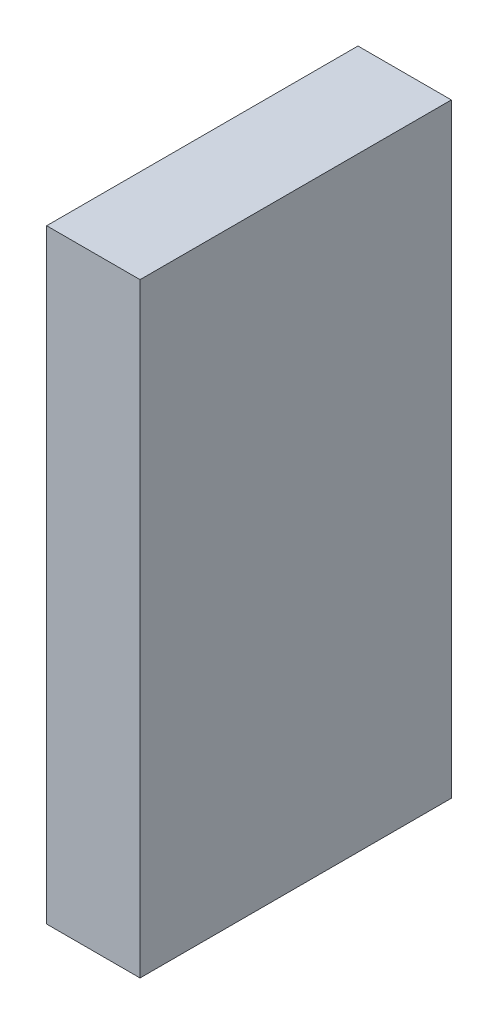
ISO-10303-21;
HEADER;
FILE_DESCRIPTION(('STEP AP214'),'2;1');
FILE_NAME('part.step','',(''),(''),'','','');
FILE_SCHEMA(('AUTOMOTIVE_DESIGN { 1 0 10303 214 1 1 1 1 }'));
ENDSEC;
DATA;
#1=APPLICATION_CONTEXT('core data for automotive mechanical design processes');
#2=APPLICATION_PROTOCOL_DEFINITION('international standard','automotive_design',2000,#1);
#3=PRODUCT_CONTEXT('',#1,'mechanical');
#4=PRODUCT('Part','Part','',(#3));
#5=PRODUCT_RELATED_PRODUCT_CATEGORY('part','',(#4));
#6=PRODUCT_DEFINITION_FORMATION('','',#4);
#7=PRODUCT_DEFINITION_CONTEXT('part definition',#1,'design');
#8=PRODUCT_DEFINITION('design','',#6,#7);
#9=PRODUCT_DEFINITION_SHAPE('','',#8);
#10=(LENGTH_UNIT() NAMED_UNIT(*) SI_UNIT(.MILLI.,.METRE.));
#11=(NAMED_UNIT(*) PLANE_ANGLE_UNIT() SI_UNIT($,.RADIAN.));
#12=(NAMED_UNIT(*) SI_UNIT($,.STERADIAN.) SOLID_ANGLE_UNIT());
#13=UNCERTAINTY_MEASURE_WITH_UNIT(LENGTH_MEASURE(1.E-05),#10,'distance_accuracy_value','');
#14=(GEOMETRIC_REPRESENTATION_CONTEXT(3) GLOBAL_UNCERTAINTY_ASSIGNED_CONTEXT((#13)) GLOBAL_UNIT_ASSIGNED_CONTEXT((#10,
#11,#12)) REPRESENTATION_CONTEXT('',''));
#15=CARTESIAN_POINT('',(0.,0.,0.));
#16=DIRECTION('',(0.,0.,1.));
#17=DIRECTION('',(1.,0.,0.));
#18=AXIS2_PLACEMENT_3D('',#15,#16,#17);
#19=CARTESIAN_POINT('',(4.1435,1.7,0.));
#20=DIRECTION('',(1.,0.,0.));
#21=DIRECTION('',(0.,0.,-1.));
#22=AXIS2_PLACEMENT_3D('',#19,#20,#21);
#23=PLANE('',#22);
#24=DIRECTION('',(0.,0.,-1.));
#25=VECTOR('',#24,1.);
#26=CARTESIAN_POINT('',(4.1435,-1.7,0.));
#27=LINE('',#26,#25);
#28=CARTESIAN_POINT('',(4.1435,-1.7,0.));
#29=VERTEX_POINT('',#28);
#30=CARTESIAN_POINT('',(4.1435,-1.7,1.75));
#31=VERTEX_POINT('',#30);
#32=EDGE_CURVE('E20',#29,#31,#27,.F.);
#33=ORIENTED_EDGE('',*,*,#32,.F.);
#34=DIRECTION('',(0.,1.,0.));
#35=VECTOR('',#34,1.);
#36=CARTESIAN_POINT('',(4.1435,-1.7,0.));
#37=LINE('',#36,#35);
#38=CARTESIAN_POINT('',(4.1435,1.7,0.));
#39=VERTEX_POINT('',#38);
#40=EDGE_CURVE('E80',#29,#39,#37,.T.);
#41=ORIENTED_EDGE('',*,*,#40,.T.);
#42=DIRECTION('',(0.,0.,1.));
#43=VECTOR('',#42,1.);
#44=CARTESIAN_POINT('',(4.1435,1.7,0.));
#45=LINE('',#44,#43);
#46=CARTESIAN_POINT('',(4.1435,1.7,1.75));
#47=VERTEX_POINT('',#46);
#48=EDGE_CURVE('E68',#47,#39,#45,.F.);
#49=ORIENTED_EDGE('',*,*,#48,.F.);
#50=DIRECTION('',(0.,1.,0.));
#51=VECTOR('',#50,1.);
#52=CARTESIAN_POINT('',(4.1435,-1.7,1.75));
#53=LINE('',#52,#51);
#54=EDGE_CURVE('E56',#31,#47,#53,.T.);
#55=ORIENTED_EDGE('',*,*,#54,.F.);
#56=EDGE_LOOP('',(#33,#41,#49,#55));
#57=FACE_BOUND('',#56,.T.);
#58=ADVANCED_FACE('F17',(#57),#23,.T.);
#59=CARTESIAN_POINT('',(4.1435,-1.7,0.));
#60=DIRECTION('',(0.,-1.,0.));
#61=DIRECTION('',(0.,0.,-1.));
#62=AXIS2_PLACEMENT_3D('',#59,#60,#61);
#63=PLANE('',#62);
#64=DIRECTION('',(0.,0.,1.));
#65=VECTOR('',#64,1.);
#66=CARTESIAN_POINT('',(3.6185,-1.7,0.));
#67=LINE('',#66,#65);
#68=CARTESIAN_POINT('',(3.6185,-1.7,0.));
#69=VERTEX_POINT('',#68);
#70=CARTESIAN_POINT('',(3.6185,-1.7,1.75));
#71=VERTEX_POINT('',#70);
#72=EDGE_CURVE('E83',#69,#71,#67,.T.);
#73=ORIENTED_EDGE('',*,*,#72,.F.);
#74=DIRECTION('',(1.,0.,0.));
#75=VECTOR('',#74,1.);
#76=CARTESIAN_POINT('',(3.6185,-1.7,0.));
#77=LINE('',#76,#75);
#78=EDGE_CURVE('E65',#69,#29,#77,.T.);
#79=ORIENTED_EDGE('',*,*,#78,.T.);
#80=ORIENTED_EDGE('',*,*,#32,.T.);
#81=DIRECTION('',(1.,0.,0.));
#82=VECTOR('',#81,1.);
#83=CARTESIAN_POINT('',(3.6185,-1.7,1.75));
#84=LINE('',#83,#82);
#85=EDGE_CURVE('E62',#71,#31,#84,.T.);
#86=ORIENTED_EDGE('',*,*,#85,.F.);
#87=EDGE_LOOP('',(#73,#79,#80,#86));
#88=FACE_BOUND('',#87,.T.);
#89=ADVANCED_FACE('F61',(#88),#63,.T.);
#90=CARTESIAN_POINT('',(3.6185,-1.7,1.75));
#91=DIRECTION('',(0.,0.,1.));
#92=DIRECTION('',(1.,0.,0.));
#93=AXIS2_PLACEMENT_3D('',#90,#91,#92);
#94=PLANE('',#93);
#95=DIRECTION('',(1.,0.,0.));
#96=VECTOR('',#95,1.);
#97=CARTESIAN_POINT('',(3.6185,1.7,1.75));
#98=LINE('',#97,#96);
#99=CARTESIAN_POINT('',(3.6185,1.7,1.75));
#100=VERTEX_POINT('',#99);
#101=EDGE_CURVE('E70',#100,#47,#98,.T.);
#102=ORIENTED_EDGE('',*,*,#101,.F.);
#103=DIRECTION('',(0.,1.,0.));
#104=VECTOR('',#103,1.);
#105=CARTESIAN_POINT('',(3.6185,-1.7,1.75));
#106=LINE('',#105,#104);
#107=EDGE_CURVE('E74',#71,#100,#106,.T.);
#108=ORIENTED_EDGE('',*,*,#107,.F.);
#109=ORIENTED_EDGE('',*,*,#85,.T.);
#110=ORIENTED_EDGE('',*,*,#54,.T.);
#111=EDGE_LOOP('',(#102,#108,#109,#110));
#112=FACE_BOUND('',#111,.T.);
#113=ADVANCED_FACE('F72',(#112),#94,.T.);
#114=CARTESIAN_POINT('',(3.6185,1.7,0.));
#115=DIRECTION('',(0.,1.,0.));
#116=DIRECTION('',(0.,0.,1.));
#117=AXIS2_PLACEMENT_3D('',#114,#115,#116);
#118=PLANE('',#117);
#119=ORIENTED_EDGE('',*,*,#48,.T.);
#120=DIRECTION('',(1.,0.,0.));
#121=VECTOR('',#120,1.);
#122=CARTESIAN_POINT('',(3.6185,1.7,0.));
#123=LINE('',#122,#121);
#124=CARTESIAN_POINT('',(3.6185,1.7,0.));
#125=VERTEX_POINT('',#124);
#126=EDGE_CURVE('E35',#39,#125,#123,.F.);
#127=ORIENTED_EDGE('',*,*,#126,.T.);
#128=DIRECTION('',(0.,0.,1.));
#129=VECTOR('',#128,1.);
#130=CARTESIAN_POINT('',(3.6185,1.7,0.));
#131=LINE('',#130,#129);
#132=EDGE_CURVE('E26',#100,#125,#131,.F.);
#133=ORIENTED_EDGE('',*,*,#132,.F.);
#134=ORIENTED_EDGE('',*,*,#101,.T.);
#135=EDGE_LOOP('',(#119,#127,#133,#134));
#136=FACE_BOUND('',#135,.T.);
#137=ADVANCED_FACE('F89',(#136),#118,.T.);
#138=CARTESIAN_POINT('',(3.6185,-1.7,0.));
#139=DIRECTION('',(0.,0.,1.));
#140=DIRECTION('',(1.,0.,0.));
#141=AXIS2_PLACEMENT_3D('',#138,#139,#140);
#142=PLANE('',#141);
#143=ORIENTED_EDGE('',*,*,#126,.F.);
#144=ORIENTED_EDGE('',*,*,#40,.F.);
#145=ORIENTED_EDGE('',*,*,#78,.F.);
#146=DIRECTION('',(0.,1.,0.));
#147=VECTOR('',#146,1.);
#148=CARTESIAN_POINT('',(3.6185,-1.7,0.));
#149=LINE('',#148,#147);
#150=EDGE_CURVE('E11',#125,#69,#149,.F.);
#151=ORIENTED_EDGE('',*,*,#150,.F.);
#152=EDGE_LOOP('',(#143,#144,#145,#151));
#153=FACE_BOUND('',#152,.T.);
#154=ADVANCED_FACE('F91',(#153),#142,.F.);
#155=CARTESIAN_POINT('',(3.6185,-1.7,0.));
#156=DIRECTION('',(-1.,0.,0.));
#157=DIRECTION('',(0.,0.,1.));
#158=AXIS2_PLACEMENT_3D('',#155,#156,#157);
#159=PLANE('',#158);
#160=ORIENTED_EDGE('',*,*,#132,.T.);
#161=ORIENTED_EDGE('',*,*,#150,.T.);
#162=ORIENTED_EDGE('',*,*,#72,.T.);
#163=ORIENTED_EDGE('',*,*,#107,.T.);
#164=EDGE_LOOP('',(#160,#161,#162,#163));
#165=FACE_BOUND('',#164,.T.);
#166=ADVANCED_FACE('F88',(#165),#159,.T.);
#167=CLOSED_SHELL('',(#58,#89,#113,#137,#154,#166));
#168=MANIFOLD_SOLID_BREP('B1',#167);
#169=ADVANCED_BREP_SHAPE_REPRESENTATION('',(#18,#168),#14);
#170=SHAPE_DEFINITION_REPRESENTATION(#9,#169);
ENDSEC;
END-ISO-10303-21;
